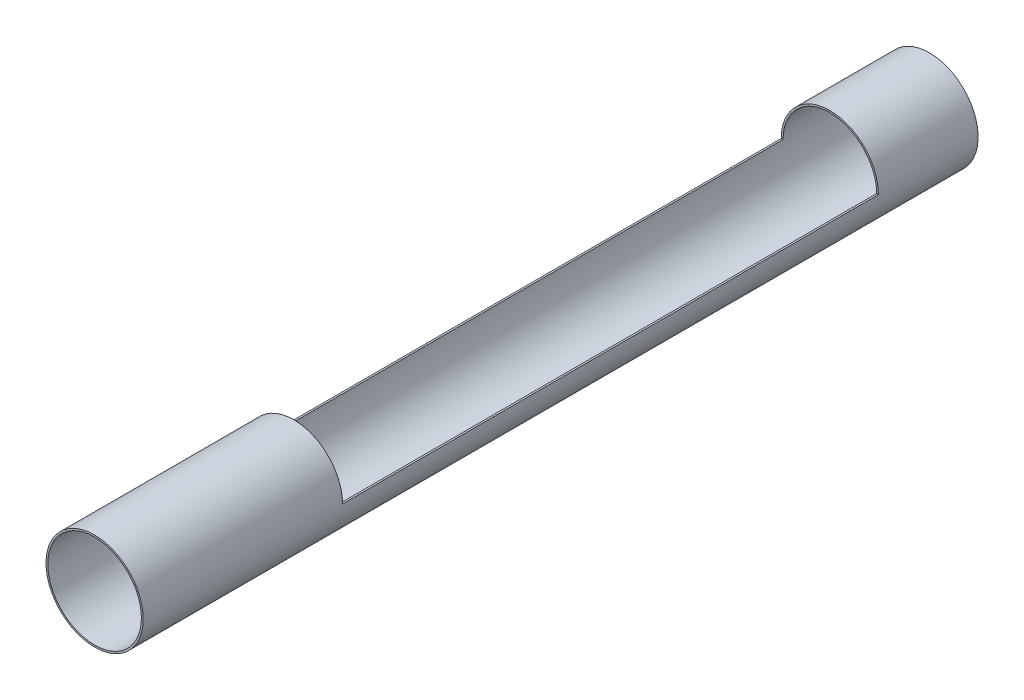
ISO-10303-21;
HEADER;
FILE_DESCRIPTION(('STEP AP214'),'2;1');
FILE_NAME('part.step','',(''),(''),'','','');
FILE_SCHEMA(('AUTOMOTIVE_DESIGN { 1 0 10303 214 1 1 1 1 }'));
ENDSEC;
DATA;
#1=APPLICATION_CONTEXT('core data for automotive mechanical design processes');
#2=APPLICATION_PROTOCOL_DEFINITION('international standard','automotive_design',2000,#1);
#3=PRODUCT_CONTEXT('',#1,'mechanical');
#4=PRODUCT('Part','Part','',(#3));
#5=PRODUCT_RELATED_PRODUCT_CATEGORY('part','',(#4));
#6=PRODUCT_DEFINITION_FORMATION('','',#4);
#7=PRODUCT_DEFINITION_CONTEXT('part definition',#1,'design');
#8=PRODUCT_DEFINITION('design','',#6,#7);
#9=PRODUCT_DEFINITION_SHAPE('','',#8);
#10=(LENGTH_UNIT() NAMED_UNIT(*) SI_UNIT(.MILLI.,.METRE.));
#11=(NAMED_UNIT(*) PLANE_ANGLE_UNIT() SI_UNIT($,.RADIAN.));
#12=(NAMED_UNIT(*) SI_UNIT($,.STERADIAN.) SOLID_ANGLE_UNIT());
#13=UNCERTAINTY_MEASURE_WITH_UNIT(LENGTH_MEASURE(1.E-05),#10,'distance_accuracy_value','');
#14=(GEOMETRIC_REPRESENTATION_CONTEXT(3) GLOBAL_UNCERTAINTY_ASSIGNED_CONTEXT((#13)) GLOBAL_UNIT_ASSIGNED_CONTEXT((#10,
#11,#12)) REPRESENTATION_CONTEXT('',''));
#15=CARTESIAN_POINT('',(0.,0.,0.));
#16=DIRECTION('',(0.,0.,1.));
#17=DIRECTION('',(1.,0.,0.));
#18=AXIS2_PLACEMENT_3D('',#15,#16,#17);
#19=CARTESIAN_POINT('',(0.,0.,546.1));
#20=DIRECTION('',(0.,0.,-1.));
#21=DIRECTION('',(-1.,0.,0.));
#22=AXIS2_PLACEMENT_3D('',#19,#20,#21);
#23=CYLINDRICAL_SURFACE('',#22,47.6885);
#24=DIRECTION('',(0.,0.,-1.));
#25=VECTOR('',#24,1.);
#26=CARTESIAN_POINT('',(47.6885,0.,546.1));
#27=LINE('',#26,#25);
#28=CARTESIAN_POINT('',(47.6885,0.,546.1));
#29=VERTEX_POINT('',#28);
#30=CARTESIAN_POINT('',(47.6885,0.,0.));
#31=VERTEX_POINT('',#30);
#32=EDGE_CURVE('E95',#29,#31,#27,.T.);
#33=ORIENTED_EDGE('',*,*,#32,.T.);
#34=CARTESIAN_POINT('',(0.,0.,0.));
#35=DIRECTION('',(0.,0.,-1.));
#36=DIRECTION('',(-1.,0.,0.));
#37=AXIS2_PLACEMENT_3D('',#34,#35,#36);
#38=CIRCLE('',#37,47.6885);
#39=CARTESIAN_POINT('',(-47.6885,0.,0.));
#40=VERTEX_POINT('',#39);
#41=EDGE_CURVE('E79',#40,#31,#38,.T.);
#42=ORIENTED_EDGE('',*,*,#41,.F.);
#43=DIRECTION('',(0.,0.,-1.));
#44=VECTOR('',#43,1.);
#45=CARTESIAN_POINT('',(-47.6885,0.,546.1));
#46=LINE('',#45,#44);
#47=CARTESIAN_POINT('',(-47.6885,0.,546.1));
#48=VERTEX_POINT('',#47);
#49=EDGE_CURVE('E11',#48,#40,#46,.T.);
#50=ORIENTED_EDGE('',*,*,#49,.F.);
#51=CARTESIAN_POINT('',(0.,0.,546.1));
#52=DIRECTION('',(0.,0.,1.));
#53=DIRECTION('',(1.,0.,0.));
#54=AXIS2_PLACEMENT_3D('',#51,#52,#53);
#55=CIRCLE('',#54,47.6885);
#56=EDGE_CURVE('E109',#29,#48,#55,.T.);
#57=ORIENTED_EDGE('',*,*,#56,.F.);
#58=EDGE_LOOP('',(#33,#42,#50,#57));
#59=FACE_BOUND('',#58,.T.);
#60=CARTESIAN_POINT('',(0.,0.,749.3));
#61=DIRECTION('',(0.,0.,1.));
#62=DIRECTION('',(1.,0.,0.));
#63=AXIS2_PLACEMENT_3D('',#60,#61,#62);
#64=CIRCLE('',#63,47.6885);
#65=CARTESIAN_POINT('',(47.6885,0.,749.3));
#66=VERTEX_POINT('',#65);
#67=EDGE_CURVE('E106',#66,#66,#64,.T.);
#68=ORIENTED_EDGE('',*,*,#67,.T.);
#69=EDGE_LOOP('',(#68));
#70=FACE_BOUND('',#69,.T.);
#71=CARTESIAN_POINT('',(0.,0.,-101.6));
#72=DIRECTION('',(0.,0.,-1.));
#73=DIRECTION('',(-1.,0.,0.));
#74=AXIS2_PLACEMENT_3D('',#71,#72,#73);
#75=CIRCLE('',#74,47.6885);
#76=CARTESIAN_POINT('',(-47.6885,0.,-101.6));
#77=VERTEX_POINT('',#76);
#78=EDGE_CURVE('E89',#77,#77,#75,.T.);
#79=ORIENTED_EDGE('',*,*,#78,.T.);
#80=EDGE_LOOP('',(#79));
#81=FACE_BOUND('',#80,.T.);
#82=ADVANCED_FACE('F37',(#59,#70,#81),#23,.F.);
#83=CARTESIAN_POINT('',(-49.5046,0.,546.1));
#84=DIRECTION('',(0.,-1.,0.));
#85=DIRECTION('',(0.,0.,-1.));
#86=AXIS2_PLACEMENT_3D('',#83,#84,#85);
#87=PLANE('',#86);
#88=DIRECTION('',(-1.,0.,0.));
#89=VECTOR('',#88,1.);
#90=CARTESIAN_POINT('',(-49.5046,0.,0.));
#91=LINE('',#90,#89);
#92=CARTESIAN_POINT('',(-49.5046,0.,0.));
#93=VERTEX_POINT('',#92);
#94=EDGE_CURVE('E83',#40,#93,#91,.T.);
#95=ORIENTED_EDGE('',*,*,#94,.T.);
#96=DIRECTION('',(0.,0.,-1.));
#97=VECTOR('',#96,1.);
#98=CARTESIAN_POINT('',(-49.5046,0.,546.1));
#99=LINE('',#98,#97);
#100=CARTESIAN_POINT('',(-49.5046,0.,546.1));
#101=VERTEX_POINT('',#100);
#102=EDGE_CURVE('E45',#101,#93,#99,.T.);
#103=ORIENTED_EDGE('',*,*,#102,.F.);
#104=DIRECTION('',(-1.,0.,0.));
#105=VECTOR('',#104,1.);
#106=CARTESIAN_POINT('',(-49.5046,0.,546.1));
#107=LINE('',#106,#105);
#108=EDGE_CURVE('E82',#48,#101,#107,.T.);
#109=ORIENTED_EDGE('',*,*,#108,.F.);
#110=ORIENTED_EDGE('',*,*,#49,.T.);
#111=EDGE_LOOP('',(#95,#103,#109,#110));
#112=FACE_BOUND('',#111,.T.);
#113=ADVANCED_FACE('F135',(#112),#87,.F.);
#114=CARTESIAN_POINT('',(0.,0.,546.1));
#115=DIRECTION('',(0.,0.,-1.));
#116=DIRECTION('',(-1.,0.,0.));
#117=AXIS2_PLACEMENT_3D('',#114,#115,#116);
#118=CYLINDRICAL_SURFACE('',#117,49.5046);
#119=ORIENTED_EDGE('',*,*,#102,.T.);
#120=CARTESIAN_POINT('',(0.,0.,0.));
#121=DIRECTION('',(0.,0.,-1.));
#122=DIRECTION('',(-1.,0.,0.));
#123=AXIS2_PLACEMENT_3D('',#120,#121,#122);
#124=CIRCLE('',#123,49.5046);
#125=CARTESIAN_POINT('',(49.5046,0.,0.));
#126=VERTEX_POINT('',#125);
#127=EDGE_CURVE('E76',#93,#126,#124,.T.);
#128=ORIENTED_EDGE('',*,*,#127,.T.);
#129=DIRECTION('',(0.,0.,-1.));
#130=VECTOR('',#129,1.);
#131=CARTESIAN_POINT('',(49.5046,0.,546.1));
#132=LINE('',#131,#130);
#133=CARTESIAN_POINT('',(49.5046,0.,546.1));
#134=VERTEX_POINT('',#133);
#135=EDGE_CURVE('E52',#134,#126,#132,.T.);
#136=ORIENTED_EDGE('',*,*,#135,.F.);
#137=CARTESIAN_POINT('',(0.,0.,546.1));
#138=DIRECTION('',(0.,0.,1.));
#139=DIRECTION('',(1.,0.,0.));
#140=AXIS2_PLACEMENT_3D('',#137,#138,#139);
#141=CIRCLE('',#140,49.5046);
#142=EDGE_CURVE('E104',#134,#101,#141,.T.);
#143=ORIENTED_EDGE('',*,*,#142,.T.);
#144=EDGE_LOOP('',(#119,#128,#136,#143));
#145=FACE_BOUND('',#144,.T.);
#146=CARTESIAN_POINT('',(0.,0.,749.3));
#147=DIRECTION('',(0.,0.,1.));
#148=DIRECTION('',(1.,0.,0.));
#149=AXIS2_PLACEMENT_3D('',#146,#147,#148);
#150=CIRCLE('',#149,49.5046);
#151=CARTESIAN_POINT('',(49.5046,0.,749.3));
#152=VERTEX_POINT('',#151);
#153=EDGE_CURVE('E100',#152,#152,#150,.T.);
#154=ORIENTED_EDGE('',*,*,#153,.F.);
#155=EDGE_LOOP('',(#154));
#156=FACE_BOUND('',#155,.T.);
#157=CARTESIAN_POINT('',(0.,0.,-101.6));
#158=DIRECTION('',(0.,0.,-1.));
#159=DIRECTION('',(-1.,0.,0.));
#160=AXIS2_PLACEMENT_3D('',#157,#158,#159);
#161=CIRCLE('',#160,49.5046);
#162=CARTESIAN_POINT('',(-49.5046,0.,-101.6));
#163=VERTEX_POINT('',#162);
#164=EDGE_CURVE('E88',#163,#163,#161,.T.);
#165=ORIENTED_EDGE('',*,*,#164,.F.);
#166=EDGE_LOOP('',(#165));
#167=FACE_BOUND('',#166,.T.);
#168=ADVANCED_FACE('F86',(#145,#156,#167),#118,.T.);
#169=CARTESIAN_POINT('',(47.6885,0.,546.1));
#170=DIRECTION('',(0.,-1.,0.));
#171=DIRECTION('',(0.,0.,-1.));
#172=AXIS2_PLACEMENT_3D('',#169,#170,#171);
#173=PLANE('',#172);
#174=DIRECTION('',(-1.,0.,0.));
#175=VECTOR('',#174,1.);
#176=CARTESIAN_POINT('',(47.6885,0.,0.));
#177=LINE('',#176,#175);
#178=EDGE_CURVE('E74',#126,#31,#177,.T.);
#179=ORIENTED_EDGE('',*,*,#178,.T.);
#180=ORIENTED_EDGE('',*,*,#32,.F.);
#181=DIRECTION('',(-1.,0.,0.));
#182=VECTOR('',#181,1.);
#183=CARTESIAN_POINT('',(47.6885,0.,546.1));
#184=LINE('',#183,#182);
#185=EDGE_CURVE('E93',#134,#29,#184,.T.);
#186=ORIENTED_EDGE('',*,*,#185,.F.);
#187=ORIENTED_EDGE('',*,*,#135,.T.);
#188=EDGE_LOOP('',(#179,#180,#186,#187));
#189=FACE_BOUND('',#188,.T.);
#190=ADVANCED_FACE('F91',(#189),#173,.F.);
#191=CARTESIAN_POINT('',(0.,0.,546.1));
#192=DIRECTION('',(0.,0.,1.));
#193=DIRECTION('',(1.,0.,0.));
#194=AXIS2_PLACEMENT_3D('',#191,#192,#193);
#195=PLANE('',#194);
#196=ORIENTED_EDGE('',*,*,#56,.T.);
#197=ORIENTED_EDGE('',*,*,#108,.T.);
#198=ORIENTED_EDGE('',*,*,#142,.F.);
#199=ORIENTED_EDGE('',*,*,#185,.T.);
#200=EDGE_LOOP('',(#196,#197,#198,#199));
#201=FACE_BOUND('',#200,.T.);
#202=ADVANCED_FACE('F131',(#201),#195,.F.);
#203=CARTESIAN_POINT('',(0.,0.,749.3));
#204=DIRECTION('',(0.,0.,1.));
#205=DIRECTION('',(1.,0.,0.));
#206=AXIS2_PLACEMENT_3D('',#203,#204,#205);
#207=PLANE('',#206);
#208=ORIENTED_EDGE('',*,*,#153,.T.);
#209=EDGE_LOOP('',(#208));
#210=FACE_BOUND('',#209,.T.);
#211=ORIENTED_EDGE('',*,*,#67,.F.);
#212=EDGE_LOOP('',(#211));
#213=FACE_BOUND('',#212,.T.);
#214=ADVANCED_FACE('F123',(#210,#213),#207,.T.);
#215=CARTESIAN_POINT('',(0.,0.,-101.6));
#216=DIRECTION('',(0.,0.,-1.));
#217=DIRECTION('',(-1.,0.,0.));
#218=AXIS2_PLACEMENT_3D('',#215,#216,#217);
#219=PLANE('',#218);
#220=ORIENTED_EDGE('',*,*,#164,.T.);
#221=EDGE_LOOP('',(#220));
#222=FACE_BOUND('',#221,.T.);
#223=ORIENTED_EDGE('',*,*,#78,.F.);
#224=EDGE_LOOP('',(#223));
#225=FACE_BOUND('',#224,.T.);
#226=ADVANCED_FACE('F121',(#222,#225),#219,.T.);
#227=CARTESIAN_POINT('',(0.,0.,0.));
#228=DIRECTION('',(0.,0.,-1.));
#229=DIRECTION('',(-1.,0.,0.));
#230=AXIS2_PLACEMENT_3D('',#227,#228,#229);
#231=PLANE('',#230);
#232=ORIENTED_EDGE('',*,*,#178,.F.);
#233=ORIENTED_EDGE('',*,*,#127,.F.);
#234=ORIENTED_EDGE('',*,*,#94,.F.);
#235=ORIENTED_EDGE('',*,*,#41,.T.);
#236=EDGE_LOOP('',(#232,#233,#234,#235));
#237=FACE_BOUND('',#236,.T.);
#238=ADVANCED_FACE('F75',(#237),#231,.F.);
#239=CLOSED_SHELL('',(#82,#113,#168,#190,#202,#214,#226,#238));
#240=MANIFOLD_SOLID_BREP('B2',#239);
#241=ADVANCED_BREP_SHAPE_REPRESENTATION('',(#18,#240),#14);
#242=SHAPE_DEFINITION_REPRESENTATION(#9,#241);
ENDSEC;
END-ISO-10303-21;
